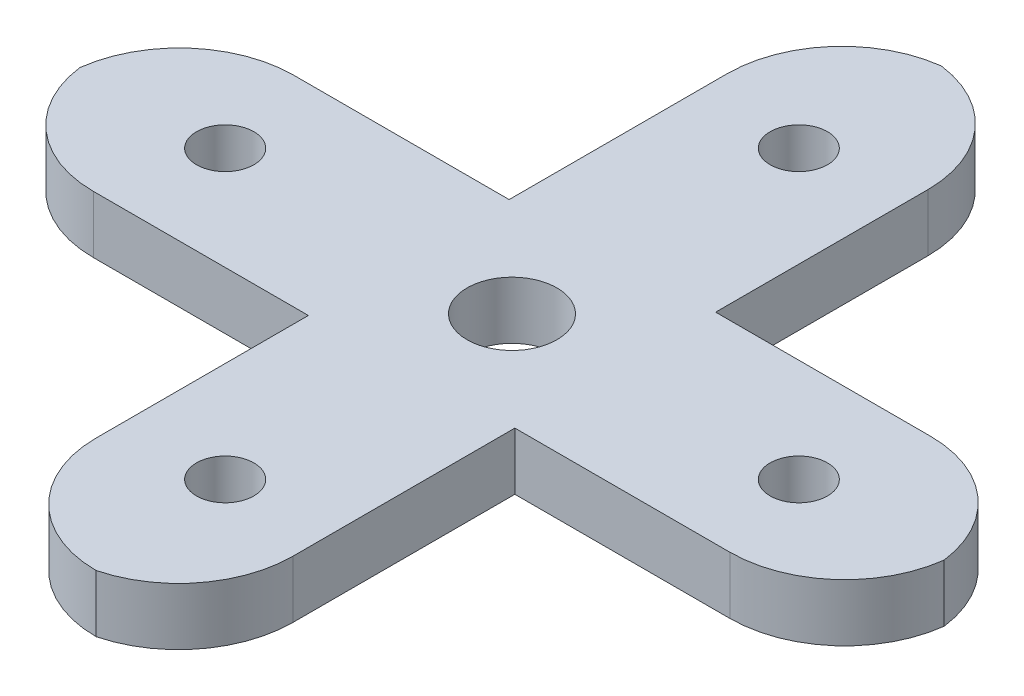
ISO-10303-21;
HEADER;
FILE_DESCRIPTION(('STEP AP214'),'2;1');
FILE_NAME('part.step','',(''),(''),'','','');
FILE_SCHEMA(('AUTOMOTIVE_DESIGN { 1 0 10303 214 1 1 1 1 }'));
ENDSEC;
DATA;
#1=APPLICATION_CONTEXT('core data for automotive mechanical design processes');
#2=APPLICATION_PROTOCOL_DEFINITION('international standard','automotive_design',2000,#1);
#3=PRODUCT_CONTEXT('',#1,'mechanical');
#4=PRODUCT('Part','Part','',(#3));
#5=PRODUCT_RELATED_PRODUCT_CATEGORY('part','',(#4));
#6=PRODUCT_DEFINITION_FORMATION('','',#4);
#7=PRODUCT_DEFINITION_CONTEXT('part definition',#1,'design');
#8=PRODUCT_DEFINITION('design','',#6,#7);
#9=PRODUCT_DEFINITION_SHAPE('','',#8);
#10=(LENGTH_UNIT() NAMED_UNIT(*) SI_UNIT(.MILLI.,.METRE.));
#11=(NAMED_UNIT(*) PLANE_ANGLE_UNIT() SI_UNIT($,.RADIAN.));
#12=(NAMED_UNIT(*) SI_UNIT($,.STERADIAN.) SOLID_ANGLE_UNIT());
#13=UNCERTAINTY_MEASURE_WITH_UNIT(LENGTH_MEASURE(1.E-05),#10,'distance_accuracy_value','');
#14=(GEOMETRIC_REPRESENTATION_CONTEXT(3) GLOBAL_UNCERTAINTY_ASSIGNED_CONTEXT((#13)) GLOBAL_UNIT_ASSIGNED_CONTEXT((#10,
#11,#12)) REPRESENTATION_CONTEXT('',''));
#15=CARTESIAN_POINT('',(0.,0.,0.));
#16=DIRECTION('',(0.,0.,1.));
#17=DIRECTION('',(1.,0.,0.));
#18=AXIS2_PLACEMENT_3D('',#15,#16,#17);
#19=CARTESIAN_POINT('',(4.68923076923077,2.54,-3.51692307692307));
#20=DIRECTION('',(-1.,0.,0.));
#21=DIRECTION('',(0.,0.,1.));
#22=AXIS2_PLACEMENT_3D('',#19,#20,#21);
#23=PLANE('',#22);
#24=DIRECTION('',(0.,0.,-1.));
#25=VECTOR('',#24,1.);
#26=CARTESIAN_POINT('',(4.68923076923077,0.,-3.51692307692307));
#27=LINE('',#26,#25);
#28=CARTESIAN_POINT('',(4.68923076923077,0.,-3.51692307692307));
#29=VERTEX_POINT('',#28);
#30=CARTESIAN_POINT('',(4.68923076923077,0.,-12.9149230769231));
#31=VERTEX_POINT('',#30);
#32=EDGE_CURVE('E191',#29,#31,#27,.T.);
#33=ORIENTED_EDGE('',*,*,#32,.T.);
#34=DIRECTION('',(0.,-1.,0.));
#35=VECTOR('',#34,1.);
#36=CARTESIAN_POINT('',(4.68923076923077,2.54,-12.9149230769231));
#37=LINE('',#36,#35);
#38=CARTESIAN_POINT('',(4.68923076923077,2.54,-12.9149230769231));
#39=VERTEX_POINT('',#38);
#40=EDGE_CURVE('E255',#31,#39,#37,.F.);
#41=ORIENTED_EDGE('',*,*,#40,.T.);
#42=DIRECTION('',(0.,0.,-1.));
#43=VECTOR('',#42,1.);
#44=CARTESIAN_POINT('',(4.68923076923077,2.54,-3.51692307692307));
#45=LINE('',#44,#43);
#46=CARTESIAN_POINT('',(4.68923076923077,2.54,-3.51692307692307));
#47=VERTEX_POINT('',#46);
#48=EDGE_CURVE('E158',#47,#39,#45,.T.);
#49=ORIENTED_EDGE('',*,*,#48,.F.);
#50=DIRECTION('',(0.,-1.,0.));
#51=VECTOR('',#50,1.);
#52=CARTESIAN_POINT('',(4.68923076923077,2.54,-3.51692307692307));
#53=LINE('',#52,#51);
#54=EDGE_CURVE('E190',#47,#29,#53,.T.);
#55=ORIENTED_EDGE('',*,*,#54,.T.);
#56=EDGE_LOOP('',(#33,#41,#49,#55));
#57=FACE_BOUND('',#56,.T.);
#58=ADVANCED_FACE('F35',(#57),#23,.F.);
#59=CARTESIAN_POINT('',(-4.20076923076923,2.54,-17.9949230769231));
#60=DIRECTION('',(1.,0.,0.));
#61=DIRECTION('',(0.,0.,-1.));
#62=AXIS2_PLACEMENT_3D('',#59,#60,#61);
#63=PLANE('',#62);
#64=DIRECTION('',(0.,0.,1.));
#65=VECTOR('',#64,1.);
#66=CARTESIAN_POINT('',(-4.20076923076923,2.54,-17.9949230769231));
#67=LINE('',#66,#65);
#68=CARTESIAN_POINT('',(-4.20076923076923,2.54,-12.9149230769231));
#69=VERTEX_POINT('',#68);
#70=CARTESIAN_POINT('',(-4.20076923076923,2.54,-3.26292307692308));
#71=VERTEX_POINT('',#70);
#72=EDGE_CURVE('E148',#69,#71,#67,.T.);
#73=ORIENTED_EDGE('',*,*,#72,.F.);
#74=DIRECTION('',(0.,-1.,0.));
#75=VECTOR('',#74,1.);
#76=CARTESIAN_POINT('',(-4.20076923076923,2.54,-12.9149230769231));
#77=LINE('',#76,#75);
#78=CARTESIAN_POINT('',(-4.20076923076923,0.,-12.9149230769231));
#79=VERTEX_POINT('',#78);
#80=EDGE_CURVE('E225',#69,#79,#77,.T.);
#81=ORIENTED_EDGE('',*,*,#80,.T.);
#82=DIRECTION('',(0.,0.,1.));
#83=VECTOR('',#82,1.);
#84=CARTESIAN_POINT('',(-4.20076923076923,0.,-17.9949230769231));
#85=LINE('',#84,#83);
#86=CARTESIAN_POINT('',(-4.20076923076923,0.,-3.26292307692308));
#87=VERTEX_POINT('',#86);
#88=EDGE_CURVE('E164',#79,#87,#85,.T.);
#89=ORIENTED_EDGE('',*,*,#88,.T.);
#90=DIRECTION('',(0.,-1.,0.));
#91=VECTOR('',#90,1.);
#92=CARTESIAN_POINT('',(-4.20076923076923,2.54,-3.26292307692308));
#93=LINE('',#92,#91);
#94=EDGE_CURVE('E161',#71,#87,#93,.T.);
#95=ORIENTED_EDGE('',*,*,#94,.F.);
#96=EDGE_LOOP('',(#73,#81,#89,#95));
#97=FACE_BOUND('',#96,.T.);
#98=ADVANCED_FACE('F162',(#97),#63,.F.);
#99=CARTESIAN_POINT('',(-18.8057692307692,2.54,-3.26292307692308));
#100=DIRECTION('',(0.,0.,1.));
#101=DIRECTION('',(1.,0.,0.));
#102=AXIS2_PLACEMENT_3D('',#99,#100,#101);
#103=PLANE('',#102);
#104=DIRECTION('',(-1.,0.,0.));
#105=VECTOR('',#104,1.);
#106=CARTESIAN_POINT('',(-18.8057692307692,0.,-3.26292307692308));
#107=LINE('',#106,#105);
#108=CARTESIAN_POINT('',(-13.7257692307692,0.,-3.26292307692308));
#109=VERTEX_POINT('',#108);
#110=EDGE_CURVE('E196',#87,#109,#107,.T.);
#111=ORIENTED_EDGE('',*,*,#110,.T.);
#112=DIRECTION('',(0.,-1.,0.));
#113=VECTOR('',#112,1.);
#114=CARTESIAN_POINT('',(-13.7257692307692,2.54,-3.26292307692308));
#115=LINE('',#114,#113);
#116=CARTESIAN_POINT('',(-13.7257692307692,2.54,-3.26292307692308));
#117=VERTEX_POINT('',#116);
#118=EDGE_CURVE('E174',#109,#117,#115,.F.);
#119=ORIENTED_EDGE('',*,*,#118,.T.);
#120=DIRECTION('',(-1.,0.,0.));
#121=VECTOR('',#120,1.);
#122=CARTESIAN_POINT('',(-18.8057692307692,2.54,-3.26292307692308));
#123=LINE('',#122,#121);
#124=EDGE_CURVE('E152',#71,#117,#123,.T.);
#125=ORIENTED_EDGE('',*,*,#124,.F.);
#126=ORIENTED_EDGE('',*,*,#94,.T.);
#127=EDGE_LOOP('',(#111,#119,#125,#126));
#128=FACE_BOUND('',#127,.T.);
#129=ADVANCED_FACE('F172',(#128),#103,.F.);
#130=CARTESIAN_POINT('',(-18.8057692307692,2.54,5.62707692307692));
#131=DIRECTION('',(0.,0.,-1.));
#132=DIRECTION('',(-1.,0.,0.));
#133=AXIS2_PLACEMENT_3D('',#130,#131,#132);
#134=PLANE('',#133);
#135=DIRECTION('',(1.,0.,0.));
#136=VECTOR('',#135,1.);
#137=CARTESIAN_POINT('',(-18.8057692307692,2.54,5.62707692307692));
#138=LINE('',#137,#136);
#139=CARTESIAN_POINT('',(-13.7257692307692,2.54,5.62707692307692));
#140=VERTEX_POINT('',#139);
#141=CARTESIAN_POINT('',(-4.20076923076923,2.54,5.62707692307692));
#142=VERTEX_POINT('',#141);
#143=EDGE_CURVE('E175',#140,#142,#138,.T.);
#144=ORIENTED_EDGE('',*,*,#143,.F.);
#145=DIRECTION('',(0.,-1.,0.));
#146=VECTOR('',#145,1.);
#147=CARTESIAN_POINT('',(-13.7257692307692,2.54,5.62707692307692));
#148=LINE('',#147,#146);
#149=CARTESIAN_POINT('',(-13.7257692307692,0.,5.62707692307692));
#150=VERTEX_POINT('',#149);
#151=EDGE_CURVE('E253',#140,#150,#148,.T.);
#152=ORIENTED_EDGE('',*,*,#151,.T.);
#153=DIRECTION('',(1.,0.,0.));
#154=VECTOR('',#153,1.);
#155=CARTESIAN_POINT('',(-18.8057692307692,0.,5.62707692307692));
#156=LINE('',#155,#154);
#157=CARTESIAN_POINT('',(-4.20076923076923,0.,5.62707692307692));
#158=VERTEX_POINT('',#157);
#159=EDGE_CURVE('E198',#150,#158,#156,.T.);
#160=ORIENTED_EDGE('',*,*,#159,.T.);
#161=DIRECTION('',(0.,-1.,0.));
#162=VECTOR('',#161,1.);
#163=CARTESIAN_POINT('',(-4.20076923076923,2.54,5.62707692307692));
#164=LINE('',#163,#162);
#165=EDGE_CURVE('E169',#142,#158,#164,.T.);
#166=ORIENTED_EDGE('',*,*,#165,.F.);
#167=EDGE_LOOP('',(#144,#152,#160,#166));
#168=FACE_BOUND('',#167,.T.);
#169=ADVANCED_FACE('F453',(#168),#134,.F.);
#170=CARTESIAN_POINT('',(-4.20076923076923,2.54,5.62707692307692));
#171=DIRECTION('',(1.,0.,0.));
#172=DIRECTION('',(0.,0.,-1.));
#173=AXIS2_PLACEMENT_3D('',#170,#171,#172);
#174=PLANE('',#173);
#175=DIRECTION('',(0.,0.,1.));
#176=VECTOR('',#175,1.);
#177=CARTESIAN_POINT('',(-4.20076923076923,0.,5.62707692307692));
#178=LINE('',#177,#176);
#179=CARTESIAN_POINT('',(-4.20076923076923,0.,15.0250769230769));
#180=VERTEX_POINT('',#179);
#181=EDGE_CURVE('E200',#158,#180,#178,.T.);
#182=ORIENTED_EDGE('',*,*,#181,.T.);
#183=DIRECTION('',(0.,-1.,0.));
#184=VECTOR('',#183,1.);
#185=CARTESIAN_POINT('',(-4.20076923076923,2.54,15.0250769230769));
#186=LINE('',#185,#184);
#187=CARTESIAN_POINT('',(-4.20076923076923,2.54,15.0250769230769));
#188=VERTEX_POINT('',#187);
#189=EDGE_CURVE('E221',#180,#188,#186,.F.);
#190=ORIENTED_EDGE('',*,*,#189,.T.);
#191=DIRECTION('',(0.,0.,1.));
#192=VECTOR('',#191,1.);
#193=CARTESIAN_POINT('',(-4.20076923076923,2.54,5.62707692307692));
#194=LINE('',#193,#192);
#195=EDGE_CURVE('E177',#142,#188,#194,.T.);
#196=ORIENTED_EDGE('',*,*,#195,.F.);
#197=ORIENTED_EDGE('',*,*,#165,.T.);
#198=EDGE_LOOP('',(#182,#190,#196,#197));
#199=FACE_BOUND('',#198,.T.);
#200=ADVANCED_FACE('F449',(#199),#174,.F.);
#201=CARTESIAN_POINT('',(4.68923076923077,2.54,5.37307692307693));
#202=DIRECTION('',(-1.,0.,0.));
#203=DIRECTION('',(0.,0.,1.));
#204=AXIS2_PLACEMENT_3D('',#201,#202,#203);
#205=PLANE('',#204);
#206=DIRECTION('',(0.,0.,-1.));
#207=VECTOR('',#206,1.);
#208=CARTESIAN_POINT('',(4.68923076923077,2.54,5.37307692307693));
#209=LINE('',#208,#207);
#210=CARTESIAN_POINT('',(4.68923076923077,2.54,15.1863880733935));
#211=VERTEX_POINT('',#210);
#212=CARTESIAN_POINT('',(4.68923076923077,2.54,5.37307692307693));
#213=VERTEX_POINT('',#212);
#214=EDGE_CURVE('E183',#211,#213,#209,.T.);
#215=ORIENTED_EDGE('',*,*,#214,.F.);
#216=DIRECTION('',(0.,-1.,0.));
#217=VECTOR('',#216,1.);
#218=CARTESIAN_POINT('',(4.68923076923077,2.54,15.1863880733935));
#219=LINE('',#218,#217);
#220=CARTESIAN_POINT('',(4.68923076923077,0.,15.1863880733935));
#221=VERTEX_POINT('',#220);
#222=EDGE_CURVE('E11',#211,#221,#219,.T.);
#223=ORIENTED_EDGE('',*,*,#222,.T.);
#224=DIRECTION('',(0.,0.,-1.));
#225=VECTOR('',#224,1.);
#226=CARTESIAN_POINT('',(4.68923076923077,0.,5.37307692307693));
#227=LINE('',#226,#225);
#228=CARTESIAN_POINT('',(4.68923076923077,0.,5.37307692307693));
#229=VERTEX_POINT('',#228);
#230=EDGE_CURVE('E203',#221,#229,#227,.T.);
#231=ORIENTED_EDGE('',*,*,#230,.T.);
#232=DIRECTION('',(0.,-1.,0.));
#233=VECTOR('',#232,1.);
#234=CARTESIAN_POINT('',(4.68923076923077,2.54,5.37307692307693));
#235=LINE('',#234,#233);
#236=EDGE_CURVE('E212',#213,#229,#235,.T.);
#237=ORIENTED_EDGE('',*,*,#236,.F.);
#238=EDGE_LOOP('',(#215,#223,#231,#237));
#239=FACE_BOUND('',#238,.T.);
#240=ADVANCED_FACE('F445',(#239),#205,.F.);
#241=CARTESIAN_POINT('',(19.2942307692308,2.54,5.37307692307693));
#242=DIRECTION('',(0.,0.,-1.));
#243=DIRECTION('',(-1.,0.,0.));
#244=AXIS2_PLACEMENT_3D('',#241,#242,#243);
#245=PLANE('',#244);
#246=DIRECTION('',(1.,0.,0.));
#247=VECTOR('',#246,1.);
#248=CARTESIAN_POINT('',(19.2942307692308,0.,5.37307692307693));
#249=LINE('',#248,#247);
#250=CARTESIAN_POINT('',(14.2142307692308,0.,5.37307692307693));
#251=VERTEX_POINT('',#250);
#252=EDGE_CURVE('E205',#229,#251,#249,.T.);
#253=ORIENTED_EDGE('',*,*,#252,.T.);
#254=DIRECTION('',(0.,-1.,0.));
#255=VECTOR('',#254,1.);
#256=CARTESIAN_POINT('',(14.2142307692308,2.54,5.37307692307693));
#257=LINE('',#256,#255);
#258=CARTESIAN_POINT('',(14.2142307692308,2.54,5.37307692307693));
#259=VERTEX_POINT('',#258);
#260=EDGE_CURVE('E44',#251,#259,#257,.F.);
#261=ORIENTED_EDGE('',*,*,#260,.T.);
#262=DIRECTION('',(1.,0.,0.));
#263=VECTOR('',#262,1.);
#264=CARTESIAN_POINT('',(19.2942307692308,2.54,5.37307692307693));
#265=LINE('',#264,#263);
#266=EDGE_CURVE('E185',#213,#259,#265,.T.);
#267=ORIENTED_EDGE('',*,*,#266,.F.);
#268=ORIENTED_EDGE('',*,*,#236,.T.);
#269=EDGE_LOOP('',(#253,#261,#267,#268));
#270=FACE_BOUND('',#269,.T.);
#271=ADVANCED_FACE('F441',(#270),#245,.F.);
#272=CARTESIAN_POINT('',(19.2942307692308,2.54,-3.51692307692307));
#273=DIRECTION('',(0.,0.,1.));
#274=DIRECTION('',(1.,0.,0.));
#275=AXIS2_PLACEMENT_3D('',#272,#273,#274);
#276=PLANE('',#275);
#277=DIRECTION('',(-1.,0.,0.));
#278=VECTOR('',#277,1.);
#279=CARTESIAN_POINT('',(19.2942307692308,2.54,-3.51692307692307));
#280=LINE('',#279,#278);
#281=CARTESIAN_POINT('',(14.2142307692308,2.54,-3.51692307692307));
#282=VERTEX_POINT('',#281);
#283=EDGE_CURVE('E188',#282,#47,#280,.T.);
#284=ORIENTED_EDGE('',*,*,#283,.F.);
#285=DIRECTION('',(0.,-1.,0.));
#286=VECTOR('',#285,1.);
#287=CARTESIAN_POINT('',(14.2142307692308,2.54,-3.51692307692307));
#288=LINE('',#287,#286);
#289=CARTESIAN_POINT('',(14.2142307692308,0.,-3.51692307692307));
#290=VERTEX_POINT('',#289);
#291=EDGE_CURVE('E257',#282,#290,#288,.T.);
#292=ORIENTED_EDGE('',*,*,#291,.T.);
#293=DIRECTION('',(-1.,0.,0.));
#294=VECTOR('',#293,1.);
#295=CARTESIAN_POINT('',(19.2942307692308,0.,-3.51692307692307));
#296=LINE('',#295,#294);
#297=EDGE_CURVE('E208',#290,#29,#296,.T.);
#298=ORIENTED_EDGE('',*,*,#297,.T.);
#299=ORIENTED_EDGE('',*,*,#54,.F.);
#300=EDGE_LOOP('',(#284,#292,#298,#299));
#301=FACE_BOUND('',#300,.T.);
#302=ADVANCED_FACE('F374',(#301),#276,.F.);
#303=CARTESIAN_POINT('',(0.,2.54,0.));
#304=DIRECTION('',(0.,-1.,0.));
#305=DIRECTION('',(0.,0.,-1.));
#306=AXIS2_PLACEMENT_3D('',#303,#304,#305);
#307=PLANE('',#306);
#308=CARTESIAN_POINT('',(0.244230769230768,2.54,13.7550769230769));
#309=DIRECTION('',(0.,1.,0.));
#310=DIRECTION('',(0.,0.,1.));
#311=AXIS2_PLACEMENT_3D('',#308,#309,#310);
#312=CIRCLE('',#311,1.27);
#313=CARTESIAN_POINT('',(0.244230769230768,2.54,15.0250769230769));
#314=VERTEX_POINT('',#313);
#315=EDGE_CURVE('E538',#314,#314,#312,.T.);
#316=ORIENTED_EDGE('',*,*,#315,.F.);
#317=EDGE_LOOP('',(#316));
#318=FACE_BOUND('',#317,.T.);
#319=CARTESIAN_POINT('',(0.244230769230768,2.54,1.05507692307693));
#320=DIRECTION('',(0.,1.,0.));
#321=DIRECTION('',(0.,0.,1.));
#322=AXIS2_PLACEMENT_3D('',#319,#320,#321);
#323=CIRCLE('',#322,1.98953867319459);
#324=CARTESIAN_POINT('',(0.244230769230768,2.54,3.04461559627152));
#325=VERTEX_POINT('',#324);
#326=EDGE_CURVE('E540',#325,#325,#323,.T.);
#327=ORIENTED_EDGE('',*,*,#326,.F.);
#328=EDGE_LOOP('',(#327));
#329=FACE_BOUND('',#328,.T.);
#330=CARTESIAN_POINT('',(12.9442307692308,2.54,1.05507692307693));
#331=DIRECTION('',(0.,1.,0.));
#332=DIRECTION('',(0.,0.,1.));
#333=AXIS2_PLACEMENT_3D('',#330,#331,#332);
#334=CIRCLE('',#333,1.27);
#335=CARTESIAN_POINT('',(12.9442307692308,2.54,2.32507692307693));
#336=VERTEX_POINT('',#335);
#337=EDGE_CURVE('E546',#336,#336,#334,.T.);
#338=ORIENTED_EDGE('',*,*,#337,.F.);
#339=EDGE_LOOP('',(#338));
#340=FACE_BOUND('',#339,.T.);
#341=CARTESIAN_POINT('',(0.244230769230768,2.54,-11.6449230769231));
#342=DIRECTION('',(0.,1.,0.));
#343=DIRECTION('',(0.,0.,1.));
#344=AXIS2_PLACEMENT_3D('',#341,#342,#343);
#345=CIRCLE('',#344,1.27);
#346=CARTESIAN_POINT('',(0.244230769230768,2.54,-10.3749230769231));
#347=VERTEX_POINT('',#346);
#348=EDGE_CURVE('E281',#347,#347,#345,.T.);
#349=ORIENTED_EDGE('',*,*,#348,.F.);
#350=EDGE_LOOP('',(#349));
#351=FACE_BOUND('',#350,.T.);
#352=CARTESIAN_POINT('',(-12.4557692307692,2.54,1.05507692307693));
#353=DIRECTION('',(0.,1.,0.));
#354=DIRECTION('',(0.,0.,1.));
#355=AXIS2_PLACEMENT_3D('',#352,#353,#354);
#356=CIRCLE('',#355,1.27);
#357=CARTESIAN_POINT('',(-12.4557692307692,2.54,2.32507692307693));
#358=VERTEX_POINT('',#357);
#359=EDGE_CURVE('E273',#358,#358,#356,.T.);
#360=ORIENTED_EDGE('',*,*,#359,.F.);
#361=EDGE_LOOP('',(#360));
#362=FACE_BOUND('',#361,.T.);
#363=ORIENTED_EDGE('',*,*,#124,.T.);
#364=CARTESIAN_POINT('',(-13.7257692307692,2.54,1.81707692307692));
#365=DIRECTION('',(0.,-1.,0.));
#366=DIRECTION('',(0.,0.,-1.));
#367=AXIS2_PLACEMENT_3D('',#364,#365,#366);
#368=CIRCLE('',#367,5.08);
#369=CARTESIAN_POINT('',(-18.7659254783473,2.54,1.18207692307692));
#370=VERTEX_POINT('',#369);
#371=EDGE_CURVE('E52',#117,#370,#368,.F.);
#372=ORIENTED_EDGE('',*,*,#371,.T.);
#373=CARTESIAN_POINT('',(-13.7257692307692,2.54,0.547076923076922));
#374=DIRECTION('',(0.,-1.,0.));
#375=DIRECTION('',(0.,0.,-1.));
#376=AXIS2_PLACEMENT_3D('',#373,#374,#375);
#377=CIRCLE('',#376,5.08);
#378=EDGE_CURVE('E249',#370,#140,#377,.F.);
#379=ORIENTED_EDGE('',*,*,#378,.T.);
#380=ORIENTED_EDGE('',*,*,#143,.T.);
#381=ORIENTED_EDGE('',*,*,#195,.T.);
#382=CARTESIAN_POINT('',(0.879230769230768,2.54,15.0250769230769));
#383=DIRECTION('',(0.,-1.,0.));
#384=DIRECTION('',(0.,0.,-1.));
#385=AXIS2_PLACEMENT_3D('',#382,#383,#384);
#386=CIRCLE('',#385,5.08);
#387=CARTESIAN_POINT('',(0.879230769230768,2.54,20.1050769230769));
#388=VERTEX_POINT('',#387);
#389=EDGE_CURVE('E223',#188,#388,#386,.F.);
#390=ORIENTED_EDGE('',*,*,#389,.T.);
#391=CARTESIAN_POINT('',(-0.390769230769231,2.54,15.1863880733935));
#392=DIRECTION('',(0.,-1.,0.));
#393=DIRECTION('',(0.,0.,-1.));
#394=AXIS2_PLACEMENT_3D('',#391,#392,#393);
#395=CIRCLE('',#394,5.08);
#396=EDGE_CURVE('E241',#388,#211,#395,.F.);
#397=ORIENTED_EDGE('',*,*,#396,.T.);
#398=ORIENTED_EDGE('',*,*,#214,.T.);
#399=ORIENTED_EDGE('',*,*,#266,.T.);
#400=CARTESIAN_POINT('',(14.2142307692308,2.54,0.293076923076927));
#401=DIRECTION('',(0.,-1.,0.));
#402=DIRECTION('',(0.,0.,-1.));
#403=AXIS2_PLACEMENT_3D('',#400,#401,#402);
#404=CIRCLE('',#403,5.08);
#405=CARTESIAN_POINT('',(19.2543870168088,2.54,0.928076923076928));
#406=VERTEX_POINT('',#405);
#407=EDGE_CURVE('E243',#259,#406,#404,.F.);
#408=ORIENTED_EDGE('',*,*,#407,.T.);
#409=CARTESIAN_POINT('',(14.2142307692308,2.54,1.56307692307693));
#410=DIRECTION('',(0.,-1.,0.));
#411=DIRECTION('',(0.,0.,-1.));
#412=AXIS2_PLACEMENT_3D('',#409,#410,#411);
#413=CIRCLE('',#412,5.08);
#414=EDGE_CURVE('E245',#406,#282,#413,.F.);
#415=ORIENTED_EDGE('',*,*,#414,.T.);
#416=ORIENTED_EDGE('',*,*,#283,.T.);
#417=ORIENTED_EDGE('',*,*,#48,.T.);
#418=CARTESIAN_POINT('',(-0.390769230769233,2.54,-12.9149230769231));
#419=DIRECTION('',(0.,-1.,0.));
#420=DIRECTION('',(0.,0.,-1.));
#421=AXIS2_PLACEMENT_3D('',#418,#419,#420);
#422=CIRCLE('',#421,5.08);
#423=CARTESIAN_POINT('',(0.244230769230768,2.54,-17.9550793245011));
#424=VERTEX_POINT('',#423);
#425=EDGE_CURVE('E59',#39,#424,#422,.F.);
#426=ORIENTED_EDGE('',*,*,#425,.T.);
#427=CARTESIAN_POINT('',(0.879230769230769,2.54,-12.9149230769231));
#428=DIRECTION('',(0.,-1.,0.));
#429=DIRECTION('',(0.,0.,-1.));
#430=AXIS2_PLACEMENT_3D('',#427,#428,#429);
#431=CIRCLE('',#430,5.08);
#432=EDGE_CURVE('E154',#424,#69,#431,.F.);
#433=ORIENTED_EDGE('',*,*,#432,.T.);
#434=ORIENTED_EDGE('',*,*,#72,.T.);
#435=EDGE_LOOP('',(#363,#372,#379,#380,#381,#390,#397,#398,#399,#408,#415,#416,#417,#426,#433,#434));
#436=FACE_BOUND('',#435,.T.);
#437=ADVANCED_FACE('F150',(#318,#329,#340,#351,#362,#436),#307,.F.);
#438=CARTESIAN_POINT('',(0.,0.,0.));
#439=DIRECTION('',(0.,-1.,0.));
#440=DIRECTION('',(0.,0.,-1.));
#441=AXIS2_PLACEMENT_3D('',#438,#439,#440);
#442=PLANE('',#441);
#443=CARTESIAN_POINT('',(0.244230769230768,0.,13.7550769230769));
#444=DIRECTION('',(0.,1.,0.));
#445=DIRECTION('',(0.,0.,1.));
#446=AXIS2_PLACEMENT_3D('',#443,#444,#445);
#447=CIRCLE('',#446,1.27);
#448=CARTESIAN_POINT('',(0.244230769230768,0.,15.0250769230769));
#449=VERTEX_POINT('',#448);
#450=EDGE_CURVE('E535',#449,#449,#447,.T.);
#451=ORIENTED_EDGE('',*,*,#450,.T.);
#452=EDGE_LOOP('',(#451));
#453=FACE_BOUND('',#452,.T.);
#454=CARTESIAN_POINT('',(0.244230769230768,0.,1.05507692307693));
#455=DIRECTION('',(0.,1.,0.));
#456=DIRECTION('',(0.,0.,1.));
#457=AXIS2_PLACEMENT_3D('',#454,#455,#456);
#458=CIRCLE('',#457,1.98953867319459);
#459=CARTESIAN_POINT('',(0.244230769230768,0.,3.04461559627152));
#460=VERTEX_POINT('',#459);
#461=EDGE_CURVE('E543',#460,#460,#458,.T.);
#462=ORIENTED_EDGE('',*,*,#461,.T.);
#463=EDGE_LOOP('',(#462));
#464=FACE_BOUND('',#463,.T.);
#465=CARTESIAN_POINT('',(12.9442307692308,0.,1.05507692307693));
#466=DIRECTION('',(0.,1.,0.));
#467=DIRECTION('',(0.,0.,1.));
#468=AXIS2_PLACEMENT_3D('',#465,#466,#467);
#469=CIRCLE('',#468,1.27);
#470=CARTESIAN_POINT('',(12.9442307692308,0.,2.32507692307693));
#471=VERTEX_POINT('',#470);
#472=EDGE_CURVE('E549',#471,#471,#469,.T.);
#473=ORIENTED_EDGE('',*,*,#472,.T.);
#474=EDGE_LOOP('',(#473));
#475=FACE_BOUND('',#474,.T.);
#476=CARTESIAN_POINT('',(0.244230769230768,0.,-11.6449230769231));
#477=DIRECTION('',(0.,1.,0.));
#478=DIRECTION('',(0.,0.,1.));
#479=AXIS2_PLACEMENT_3D('',#476,#477,#478);
#480=CIRCLE('',#479,1.27);
#481=CARTESIAN_POINT('',(0.244230769230768,0.,-10.3749230769231));
#482=VERTEX_POINT('',#481);
#483=EDGE_CURVE('E278',#482,#482,#480,.T.);
#484=ORIENTED_EDGE('',*,*,#483,.T.);
#485=EDGE_LOOP('',(#484));
#486=FACE_BOUND('',#485,.T.);
#487=CARTESIAN_POINT('',(-12.4557692307692,0.,1.05507692307693));
#488=DIRECTION('',(0.,1.,0.));
#489=DIRECTION('',(0.,0.,1.));
#490=AXIS2_PLACEMENT_3D('',#487,#488,#489);
#491=CIRCLE('',#490,1.27);
#492=CARTESIAN_POINT('',(-12.4557692307692,0.,2.32507692307693));
#493=VERTEX_POINT('',#492);
#494=EDGE_CURVE('E268',#493,#493,#491,.T.);
#495=ORIENTED_EDGE('',*,*,#494,.T.);
#496=EDGE_LOOP('',(#495));
#497=FACE_BOUND('',#496,.T.);
#498=CARTESIAN_POINT('',(-13.7257692307692,0.,0.547076923076922));
#499=DIRECTION('',(0.,-1.,0.));
#500=DIRECTION('',(0.,0.,-1.));
#501=AXIS2_PLACEMENT_3D('',#498,#499,#500);
#502=CIRCLE('',#501,5.08);
#503=CARTESIAN_POINT('',(-18.7659254783473,0.,1.18207692307692));
#504=VERTEX_POINT('',#503);
#505=EDGE_CURVE('E237',#150,#504,#502,.T.);
#506=ORIENTED_EDGE('',*,*,#505,.T.);
#507=CARTESIAN_POINT('',(-13.7257692307692,0.,1.81707692307692));
#508=DIRECTION('',(0.,-1.,0.));
#509=DIRECTION('',(0.,0.,-1.));
#510=AXIS2_PLACEMENT_3D('',#507,#508,#509);
#511=CIRCLE('',#510,5.08);
#512=EDGE_CURVE('E239',#504,#109,#511,.T.);
#513=ORIENTED_EDGE('',*,*,#512,.T.);
#514=ORIENTED_EDGE('',*,*,#110,.F.);
#515=ORIENTED_EDGE('',*,*,#88,.F.);
#516=CARTESIAN_POINT('',(0.879230769230769,0.,-12.9149230769231));
#517=DIRECTION('',(0.,-1.,0.));
#518=DIRECTION('',(0.,0.,-1.));
#519=AXIS2_PLACEMENT_3D('',#516,#517,#518);
#520=CIRCLE('',#519,5.08);
#521=CARTESIAN_POINT('',(0.244230769230768,0.,-17.9550793245011));
#522=VERTEX_POINT('',#521);
#523=EDGE_CURVE('E235',#79,#522,#520,.T.);
#524=ORIENTED_EDGE('',*,*,#523,.T.);
#525=CARTESIAN_POINT('',(-0.390769230769233,0.,-12.9149230769231));
#526=DIRECTION('',(0.,-1.,0.));
#527=DIRECTION('',(0.,0.,-1.));
#528=AXIS2_PLACEMENT_3D('',#525,#526,#527);
#529=CIRCLE('',#528,5.08);
#530=EDGE_CURVE('E233',#522,#31,#529,.T.);
#531=ORIENTED_EDGE('',*,*,#530,.T.);
#532=ORIENTED_EDGE('',*,*,#32,.F.);
#533=ORIENTED_EDGE('',*,*,#297,.F.);
#534=CARTESIAN_POINT('',(14.2142307692308,0.,1.56307692307693));
#535=DIRECTION('',(0.,-1.,0.));
#536=DIRECTION('',(0.,0.,-1.));
#537=AXIS2_PLACEMENT_3D('',#534,#535,#536);
#538=CIRCLE('',#537,5.08);
#539=CARTESIAN_POINT('',(19.2543870168088,0.,0.928076923076928));
#540=VERTEX_POINT('',#539);
#541=EDGE_CURVE('E231',#290,#540,#538,.T.);
#542=ORIENTED_EDGE('',*,*,#541,.T.);
#543=CARTESIAN_POINT('',(14.2142307692308,0.,0.293076923076927));
#544=DIRECTION('',(0.,-1.,0.));
#545=DIRECTION('',(0.,0.,-1.));
#546=AXIS2_PLACEMENT_3D('',#543,#544,#545);
#547=CIRCLE('',#546,5.08);
#548=EDGE_CURVE('E229',#540,#251,#547,.T.);
#549=ORIENTED_EDGE('',*,*,#548,.T.);
#550=ORIENTED_EDGE('',*,*,#252,.F.);
#551=ORIENTED_EDGE('',*,*,#230,.F.);
#552=CARTESIAN_POINT('',(-0.390769230769231,0.,15.1863880733935));
#553=DIRECTION('',(0.,-1.,0.));
#554=DIRECTION('',(0.,0.,-1.));
#555=AXIS2_PLACEMENT_3D('',#552,#553,#554);
#556=CIRCLE('',#555,5.08);
#557=CARTESIAN_POINT('',(0.879230769230768,0.,20.1050769230769));
#558=VERTEX_POINT('',#557);
#559=EDGE_CURVE('E227',#221,#558,#556,.T.);
#560=ORIENTED_EDGE('',*,*,#559,.T.);
#561=CARTESIAN_POINT('',(0.879230769230768,0.,15.0250769230769));
#562=DIRECTION('',(0.,-1.,0.));
#563=DIRECTION('',(0.,0.,-1.));
#564=AXIS2_PLACEMENT_3D('',#561,#562,#563);
#565=CIRCLE('',#564,5.08);
#566=EDGE_CURVE('E219',#558,#180,#565,.T.);
#567=ORIENTED_EDGE('',*,*,#566,.T.);
#568=ORIENTED_EDGE('',*,*,#181,.F.);
#569=ORIENTED_EDGE('',*,*,#159,.F.);
#570=EDGE_LOOP('',(#506,#513,#514,#515,#524,#531,#532,#533,#542,#549,#550,#551,#560,#567,#568,#569));
#571=FACE_BOUND('',#570,.T.);
#572=ADVANCED_FACE('F294',(#453,#464,#475,#486,#497,#571),#442,.T.);
#573=CARTESIAN_POINT('',(0.879230769230768,2.54,15.0250769230769));
#574=DIRECTION('',(0.,-1.,0.));
#575=DIRECTION('',(0.,0.,-1.));
#576=AXIS2_PLACEMENT_3D('',#573,#574,#575);
#577=CYLINDRICAL_SURFACE('',#576,5.08);
#578=ORIENTED_EDGE('',*,*,#389,.F.);
#579=ORIENTED_EDGE('',*,*,#189,.F.);
#580=ORIENTED_EDGE('',*,*,#566,.F.);
#581=DIRECTION('',(0.,-1.,0.));
#582=VECTOR('',#581,1.);
#583=CARTESIAN_POINT('',(0.879230769230768,2.54,20.1050769230769));
#584=LINE('',#583,#582);
#585=EDGE_CURVE('E168',#388,#558,#584,.T.);
#586=ORIENTED_EDGE('',*,*,#585,.F.);
#587=EDGE_LOOP('',(#578,#579,#580,#586));
#588=FACE_BOUND('',#587,.T.);
#589=ADVANCED_FACE('F317',(#588),#577,.T.);
#590=CARTESIAN_POINT('',(-0.390769230769233,2.54,-12.9149230769231));
#591=DIRECTION('',(0.,-1.,0.));
#592=DIRECTION('',(0.,0.,-1.));
#593=AXIS2_PLACEMENT_3D('',#590,#591,#592);
#594=CYLINDRICAL_SURFACE('',#593,5.08);
#595=DIRECTION('',(0.,-1.,0.));
#596=VECTOR('',#595,1.);
#597=CARTESIAN_POINT('',(0.244230769230768,1.27,-17.9550793245011));
#598=LINE('',#597,#596);
#599=EDGE_CURVE('E194',#424,#522,#598,.T.);
#600=ORIENTED_EDGE('',*,*,#599,.F.);
#601=ORIENTED_EDGE('',*,*,#425,.F.);
#602=ORIENTED_EDGE('',*,*,#40,.F.);
#603=ORIENTED_EDGE('',*,*,#530,.F.);
#604=EDGE_LOOP('',(#600,#601,#602,#603));
#605=FACE_BOUND('',#604,.T.);
#606=ADVANCED_FACE('F289',(#605),#594,.T.);
#607=CARTESIAN_POINT('',(0.879230769230769,2.54,-12.9149230769231));
#608=DIRECTION('',(0.,-1.,0.));
#609=DIRECTION('',(0.,0.,-1.));
#610=AXIS2_PLACEMENT_3D('',#607,#608,#609);
#611=CYLINDRICAL_SURFACE('',#610,5.08);
#612=ORIENTED_EDGE('',*,*,#432,.F.);
#613=ORIENTED_EDGE('',*,*,#599,.T.);
#614=ORIENTED_EDGE('',*,*,#523,.F.);
#615=ORIENTED_EDGE('',*,*,#80,.F.);
#616=EDGE_LOOP('',(#612,#613,#614,#615));
#617=FACE_BOUND('',#616,.T.);
#618=ADVANCED_FACE('F292',(#617),#611,.T.);
#619=CARTESIAN_POINT('',(-13.7257692307692,2.54,0.547076923076922));
#620=DIRECTION('',(0.,-1.,0.));
#621=DIRECTION('',(0.,0.,-1.));
#622=AXIS2_PLACEMENT_3D('',#619,#620,#621);
#623=CYLINDRICAL_SURFACE('',#622,5.08);
#624=ORIENTED_EDGE('',*,*,#151,.F.);
#625=ORIENTED_EDGE('',*,*,#378,.F.);
#626=DIRECTION('',(0.,-1.,0.));
#627=VECTOR('',#626,1.);
#628=CARTESIAN_POINT('',(-18.7659254783473,1.27,1.18207692307692));
#629=LINE('',#628,#627);
#630=EDGE_CURVE('E262',#504,#370,#629,.F.);
#631=ORIENTED_EDGE('',*,*,#630,.F.);
#632=ORIENTED_EDGE('',*,*,#505,.F.);
#633=EDGE_LOOP('',(#624,#625,#631,#632));
#634=FACE_BOUND('',#633,.T.);
#635=ADVANCED_FACE('F298',(#634),#623,.T.);
#636=CARTESIAN_POINT('',(-13.7257692307692,2.54,1.81707692307692));
#637=DIRECTION('',(0.,-1.,0.));
#638=DIRECTION('',(0.,0.,-1.));
#639=AXIS2_PLACEMENT_3D('',#636,#637,#638);
#640=CYLINDRICAL_SURFACE('',#639,5.08);
#641=ORIENTED_EDGE('',*,*,#371,.F.);
#642=ORIENTED_EDGE('',*,*,#118,.F.);
#643=ORIENTED_EDGE('',*,*,#512,.F.);
#644=ORIENTED_EDGE('',*,*,#630,.T.);
#645=EDGE_LOOP('',(#641,#642,#643,#644));
#646=FACE_BOUND('',#645,.T.);
#647=ADVANCED_FACE('F295',(#646),#640,.T.);
#648=CARTESIAN_POINT('',(14.2142307692308,2.54,0.293076923076927));
#649=DIRECTION('',(0.,-1.,0.));
#650=DIRECTION('',(0.,0.,-1.));
#651=AXIS2_PLACEMENT_3D('',#648,#649,#650);
#652=CYLINDRICAL_SURFACE('',#651,5.08);
#653=DIRECTION('',(0.,-1.,0.));
#654=VECTOR('',#653,1.);
#655=CARTESIAN_POINT('',(19.2543870168088,1.27,0.928076923076928));
#656=LINE('',#655,#654);
#657=EDGE_CURVE('E39',#406,#540,#656,.T.);
#658=ORIENTED_EDGE('',*,*,#657,.F.);
#659=ORIENTED_EDGE('',*,*,#407,.F.);
#660=ORIENTED_EDGE('',*,*,#260,.F.);
#661=ORIENTED_EDGE('',*,*,#548,.F.);
#662=EDGE_LOOP('',(#658,#659,#660,#661));
#663=FACE_BOUND('',#662,.T.);
#664=ADVANCED_FACE('F297',(#663),#652,.T.);
#665=CARTESIAN_POINT('',(14.2142307692308,2.54,1.56307692307693));
#666=DIRECTION('',(0.,-1.,0.));
#667=DIRECTION('',(0.,0.,-1.));
#668=AXIS2_PLACEMENT_3D('',#665,#666,#667);
#669=CYLINDRICAL_SURFACE('',#668,5.08);
#670=ORIENTED_EDGE('',*,*,#414,.F.);
#671=ORIENTED_EDGE('',*,*,#657,.T.);
#672=ORIENTED_EDGE('',*,*,#541,.F.);
#673=ORIENTED_EDGE('',*,*,#291,.F.);
#674=EDGE_LOOP('',(#670,#671,#672,#673));
#675=FACE_BOUND('',#674,.T.);
#676=ADVANCED_FACE('F304',(#675),#669,.T.);
#677=CARTESIAN_POINT('',(-0.390769230769231,2.54,15.1863880733935));
#678=DIRECTION('',(0.,-1.,0.));
#679=DIRECTION('',(0.,0.,-1.));
#680=AXIS2_PLACEMENT_3D('',#677,#678,#679);
#681=CYLINDRICAL_SURFACE('',#680,5.08);
#682=ORIENTED_EDGE('',*,*,#396,.F.);
#683=ORIENTED_EDGE('',*,*,#585,.T.);
#684=ORIENTED_EDGE('',*,*,#559,.F.);
#685=ORIENTED_EDGE('',*,*,#222,.F.);
#686=EDGE_LOOP('',(#682,#683,#684,#685));
#687=FACE_BOUND('',#686,.T.);
#688=ADVANCED_FACE('F37',(#687),#681,.T.);
#689=CARTESIAN_POINT('',(-12.4557692307692,0.,1.05507692307693));
#690=DIRECTION('',(0.,1.,0.));
#691=DIRECTION('',(0.,0.,1.));
#692=AXIS2_PLACEMENT_3D('',#689,#690,#691);
#693=CYLINDRICAL_SURFACE('',#692,1.27);
#694=ORIENTED_EDGE('',*,*,#494,.F.);
#695=EDGE_LOOP('',(#694));
#696=FACE_BOUND('',#695,.T.);
#697=ORIENTED_EDGE('',*,*,#359,.T.);
#698=EDGE_LOOP('',(#697));
#699=FACE_BOUND('',#698,.T.);
#700=ADVANCED_FACE('F363',(#696,#699),#693,.F.);
#701=CARTESIAN_POINT('',(0.244230769230768,0.,-11.6449230769231));
#702=DIRECTION('',(0.,1.,0.));
#703=DIRECTION('',(0.,0.,1.));
#704=AXIS2_PLACEMENT_3D('',#701,#702,#703);
#705=CYLINDRICAL_SURFACE('',#704,1.27);
#706=ORIENTED_EDGE('',*,*,#483,.F.);
#707=EDGE_LOOP('',(#706));
#708=FACE_BOUND('',#707,.T.);
#709=ORIENTED_EDGE('',*,*,#348,.T.);
#710=EDGE_LOOP('',(#709));
#711=FACE_BOUND('',#710,.T.);
#712=ADVANCED_FACE('F393',(#708,#711),#705,.F.);
#713=CARTESIAN_POINT('',(12.9442307692308,0.,1.05507692307693));
#714=DIRECTION('',(0.,1.,0.));
#715=DIRECTION('',(0.,0.,1.));
#716=AXIS2_PLACEMENT_3D('',#713,#714,#715);
#717=CYLINDRICAL_SURFACE('',#716,1.27);
#718=ORIENTED_EDGE('',*,*,#472,.F.);
#719=EDGE_LOOP('',(#718));
#720=FACE_BOUND('',#719,.T.);
#721=ORIENTED_EDGE('',*,*,#337,.T.);
#722=EDGE_LOOP('',(#721));
#723=FACE_BOUND('',#722,.T.);
#724=ADVANCED_FACE('F403',(#720,#723),#717,.F.);
#725=CARTESIAN_POINT('',(0.244230769230768,0.,1.05507692307693));
#726=DIRECTION('',(0.,1.,0.));
#727=DIRECTION('',(0.,0.,1.));
#728=AXIS2_PLACEMENT_3D('',#725,#726,#727);
#729=CYLINDRICAL_SURFACE('',#728,1.98953867319459);
#730=ORIENTED_EDGE('',*,*,#461,.F.);
#731=EDGE_LOOP('',(#730));
#732=FACE_BOUND('',#731,.T.);
#733=ORIENTED_EDGE('',*,*,#326,.T.);
#734=EDGE_LOOP('',(#733));
#735=FACE_BOUND('',#734,.T.);
#736=ADVANCED_FACE('F413',(#732,#735),#729,.F.);
#737=CARTESIAN_POINT('',(0.244230769230768,0.,13.7550769230769));
#738=DIRECTION('',(0.,1.,0.));
#739=DIRECTION('',(0.,0.,1.));
#740=AXIS2_PLACEMENT_3D('',#737,#738,#739);
#741=CYLINDRICAL_SURFACE('',#740,1.27);
#742=ORIENTED_EDGE('',*,*,#450,.F.);
#743=EDGE_LOOP('',(#742));
#744=FACE_BOUND('',#743,.T.);
#745=ORIENTED_EDGE('',*,*,#315,.T.);
#746=EDGE_LOOP('',(#745));
#747=FACE_BOUND('',#746,.T.);
#748=ADVANCED_FACE('F423',(#744,#747),#741,.F.);
#749=CLOSED_SHELL('',(#58,#98,#129,#169,#200,#240,#271,#302,#437,#572,#589,#606,#618,#635,#647,
#664,#676,#688,#700,#712,#724,#736,#748));
#750=MANIFOLD_SOLID_BREP('B2',#749);
#751=ADVANCED_BREP_SHAPE_REPRESENTATION('',(#18,#750),#14);
#752=SHAPE_DEFINITION_REPRESENTATION(#9,#751);
ENDSEC;
END-ISO-10303-21;
